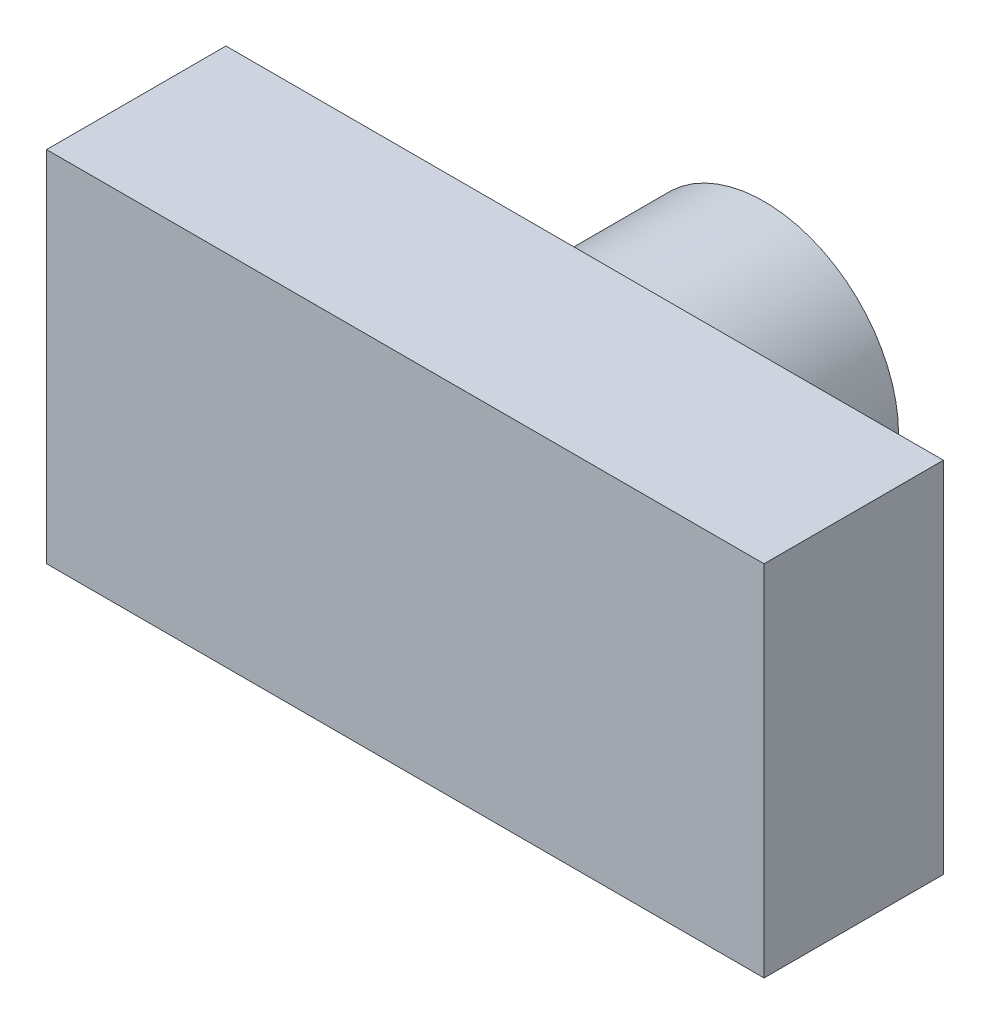
ISO-10303-21;
HEADER;
FILE_DESCRIPTION(('STEP AP214'),'2;1');
FILE_NAME('part.step','',(''),(''),'','','');
FILE_SCHEMA(('AUTOMOTIVE_DESIGN { 1 0 10303 214 1 1 1 1 }'));
ENDSEC;
DATA;
#1=APPLICATION_CONTEXT('core data for automotive mechanical design processes');
#2=APPLICATION_PROTOCOL_DEFINITION('international standard','automotive_design',2000,#1);
#3=PRODUCT_CONTEXT('',#1,'mechanical');
#4=PRODUCT('Part','Part','',(#3));
#5=PRODUCT_RELATED_PRODUCT_CATEGORY('part','',(#4));
#6=PRODUCT_DEFINITION_FORMATION('','',#4);
#7=PRODUCT_DEFINITION_CONTEXT('part definition',#1,'design');
#8=PRODUCT_DEFINITION('design','',#6,#7);
#9=PRODUCT_DEFINITION_SHAPE('','',#8);
#10=(LENGTH_UNIT() NAMED_UNIT(*) SI_UNIT(.MILLI.,.METRE.));
#11=(NAMED_UNIT(*) PLANE_ANGLE_UNIT() SI_UNIT($,.RADIAN.));
#12=(NAMED_UNIT(*) SI_UNIT($,.STERADIAN.) SOLID_ANGLE_UNIT());
#13=UNCERTAINTY_MEASURE_WITH_UNIT(LENGTH_MEASURE(1.E-05),#10,'distance_accuracy_value','');
#14=(GEOMETRIC_REPRESENTATION_CONTEXT(3) GLOBAL_UNCERTAINTY_ASSIGNED_CONTEXT((#13)) GLOBAL_UNIT_ASSIGNED_CONTEXT((#10,
#11,#12)) REPRESENTATION_CONTEXT('',''));
#15=CARTESIAN_POINT('',(0.,0.,0.));
#16=DIRECTION('',(0.,0.,1.));
#17=DIRECTION('',(1.,0.,0.));
#18=AXIS2_PLACEMENT_3D('',#15,#16,#17);
#19=CARTESIAN_POINT('',(50.8,-25.4,25.4));
#20=DIRECTION('',(-1.,0.,0.));
#21=DIRECTION('',(0.,0.,1.));
#22=AXIS2_PLACEMENT_3D('',#19,#20,#21);
#23=PLANE('',#22);
#24=DIRECTION('',(0.,1.,0.));
#25=VECTOR('',#24,1.);
#26=CARTESIAN_POINT('',(50.8,-25.4,0.));
#27=LINE('',#26,#25);
#28=CARTESIAN_POINT('',(50.8,-25.4,0.));
#29=VERTEX_POINT('',#28);
#30=CARTESIAN_POINT('',(50.8,25.4,0.));
#31=VERTEX_POINT('',#30);
#32=EDGE_CURVE('E105',#29,#31,#27,.T.);
#33=ORIENTED_EDGE('',*,*,#32,.T.);
#34=DIRECTION('',(0.,0.,-1.));
#35=VECTOR('',#34,1.);
#36=CARTESIAN_POINT('',(50.8,25.4,25.4));
#37=LINE('',#36,#35);
#38=CARTESIAN_POINT('',(50.8,25.4,25.4));
#39=VERTEX_POINT('',#38);
#40=EDGE_CURVE('E42',#39,#31,#37,.T.);
#41=ORIENTED_EDGE('',*,*,#40,.F.);
#42=DIRECTION('',(0.,1.,0.));
#43=VECTOR('',#42,1.);
#44=CARTESIAN_POINT('',(50.8,-25.4,25.4));
#45=LINE('',#44,#43);
#46=CARTESIAN_POINT('',(50.8,-25.4,25.4));
#47=VERTEX_POINT('',#46);
#48=EDGE_CURVE('E92',#47,#39,#45,.T.);
#49=ORIENTED_EDGE('',*,*,#48,.F.);
#50=DIRECTION('',(0.,0.,-1.));
#51=VECTOR('',#50,1.);
#52=CARTESIAN_POINT('',(50.8,-25.4,25.4));
#53=LINE('',#52,#51);
#54=EDGE_CURVE('E101',#47,#29,#53,.T.);
#55=ORIENTED_EDGE('',*,*,#54,.T.);
#56=EDGE_LOOP('',(#33,#41,#49,#55));
#57=FACE_BOUND('',#56,.T.);
#58=ADVANCED_FACE('F39',(#57),#23,.F.);
#59=CARTESIAN_POINT('',(-50.8,25.4,25.4));
#60=DIRECTION('',(0.,-1.,0.));
#61=DIRECTION('',(0.,0.,-1.));
#62=AXIS2_PLACEMENT_3D('',#59,#60,#61);
#63=PLANE('',#62);
#64=DIRECTION('',(-1.,0.,0.));
#65=VECTOR('',#64,1.);
#66=CARTESIAN_POINT('',(-50.8,25.4,0.));
#67=LINE('',#66,#65);
#68=CARTESIAN_POINT('',(-50.8,25.4,0.));
#69=VERTEX_POINT('',#68);
#70=EDGE_CURVE('E97',#31,#69,#67,.T.);
#71=ORIENTED_EDGE('',*,*,#70,.T.);
#72=DIRECTION('',(0.,0.,-1.));
#73=VECTOR('',#72,1.);
#74=CARTESIAN_POINT('',(-50.8,25.4,25.4));
#75=LINE('',#74,#73);
#76=CARTESIAN_POINT('',(-50.8,25.4,25.4));
#77=VERTEX_POINT('',#76);
#78=EDGE_CURVE('E95',#77,#69,#75,.T.);
#79=ORIENTED_EDGE('',*,*,#78,.F.);
#80=DIRECTION('',(-1.,0.,0.));
#81=VECTOR('',#80,1.);
#82=CARTESIAN_POINT('',(-50.8,25.4,25.4));
#83=LINE('',#82,#81);
#84=EDGE_CURVE('E87',#39,#77,#83,.T.);
#85=ORIENTED_EDGE('',*,*,#84,.F.);
#86=ORIENTED_EDGE('',*,*,#40,.T.);
#87=EDGE_LOOP('',(#71,#79,#85,#86));
#88=FACE_BOUND('',#87,.T.);
#89=ADVANCED_FACE('F96',(#88),#63,.F.);
#90=CARTESIAN_POINT('',(-50.8,-25.4,25.4));
#91=DIRECTION('',(1.,0.,0.));
#92=DIRECTION('',(0.,0.,-1.));
#93=AXIS2_PLACEMENT_3D('',#90,#91,#92);
#94=PLANE('',#93);
#95=DIRECTION('',(0.,-1.,0.));
#96=VECTOR('',#95,1.);
#97=CARTESIAN_POINT('',(-50.8,-25.4,0.));
#98=LINE('',#97,#96);
#99=CARTESIAN_POINT('',(-50.8,-25.4,0.));
#100=VERTEX_POINT('',#99);
#101=EDGE_CURVE('E73',#69,#100,#98,.T.);
#102=ORIENTED_EDGE('',*,*,#101,.T.);
#103=DIRECTION('',(0.,0.,-1.));
#104=VECTOR('',#103,1.);
#105=CARTESIAN_POINT('',(-50.8,-25.4,25.4));
#106=LINE('',#105,#104);
#107=CARTESIAN_POINT('',(-50.8,-25.4,25.4));
#108=VERTEX_POINT('',#107);
#109=EDGE_CURVE('E98',#108,#100,#106,.T.);
#110=ORIENTED_EDGE('',*,*,#109,.F.);
#111=DIRECTION('',(0.,-1.,0.));
#112=VECTOR('',#111,1.);
#113=CARTESIAN_POINT('',(-50.8,-25.4,25.4));
#114=LINE('',#113,#112);
#115=EDGE_CURVE('E90',#77,#108,#114,.T.);
#116=ORIENTED_EDGE('',*,*,#115,.F.);
#117=ORIENTED_EDGE('',*,*,#78,.T.);
#118=EDGE_LOOP('',(#102,#110,#116,#117));
#119=FACE_BOUND('',#118,.T.);
#120=ADVANCED_FACE('F99',(#119),#94,.F.);
#121=CARTESIAN_POINT('',(-50.8,-25.4,25.4));
#122=DIRECTION('',(0.,1.,0.));
#123=DIRECTION('',(0.,0.,1.));
#124=AXIS2_PLACEMENT_3D('',#121,#122,#123);
#125=PLANE('',#124);
#126=DIRECTION('',(1.,0.,0.));
#127=VECTOR('',#126,1.);
#128=CARTESIAN_POINT('',(-50.8,-25.4,0.));
#129=LINE('',#128,#127);
#130=EDGE_CURVE('E79',#100,#29,#129,.T.);
#131=ORIENTED_EDGE('',*,*,#130,.T.);
#132=ORIENTED_EDGE('',*,*,#54,.F.);
#133=DIRECTION('',(1.,0.,0.));
#134=VECTOR('',#133,1.);
#135=CARTESIAN_POINT('',(-50.8,-25.4,25.4));
#136=LINE('',#135,#134);
#137=EDGE_CURVE('E56',#108,#47,#136,.T.);
#138=ORIENTED_EDGE('',*,*,#137,.F.);
#139=ORIENTED_EDGE('',*,*,#109,.T.);
#140=EDGE_LOOP('',(#131,#132,#138,#139));
#141=FACE_BOUND('',#140,.T.);
#142=ADVANCED_FACE('F113',(#141),#125,.F.);
#143=CARTESIAN_POINT('',(0.,0.,25.4));
#144=DIRECTION('',(0.,0.,-1.));
#145=DIRECTION('',(-1.,0.,0.));
#146=AXIS2_PLACEMENT_3D('',#143,#144,#145);
#147=PLANE('',#146);
#148=ORIENTED_EDGE('',*,*,#48,.T.);
#149=ORIENTED_EDGE('',*,*,#84,.T.);
#150=ORIENTED_EDGE('',*,*,#115,.T.);
#151=ORIENTED_EDGE('',*,*,#137,.T.);
#152=EDGE_LOOP('',(#148,#149,#150,#151));
#153=FACE_BOUND('',#152,.T.);
#154=ADVANCED_FACE('F88',(#153),#147,.F.);
#155=CARTESIAN_POINT('',(0.,0.,0.));
#156=DIRECTION('',(0.,0.,-1.));
#157=DIRECTION('',(-1.,0.,0.));
#158=AXIS2_PLACEMENT_3D('',#155,#156,#157);
#159=PLANE('',#158);
#160=CARTESIAN_POINT('',(0.,0.,0.));
#161=DIRECTION('',(0.,0.,-1.));
#162=DIRECTION('',(-1.,0.,0.));
#163=AXIS2_PLACEMENT_3D('',#160,#161,#162);
#164=CIRCLE('',#163,19.05);
#165=CARTESIAN_POINT('',(-19.05,0.,0.));
#166=VERTEX_POINT('',#165);
#167=EDGE_CURVE('E11',#166,#166,#164,.T.);
#168=ORIENTED_EDGE('',*,*,#167,.F.);
#169=EDGE_LOOP('',(#168));
#170=FACE_BOUND('',#169,.T.);
#171=ORIENTED_EDGE('',*,*,#32,.F.);
#172=ORIENTED_EDGE('',*,*,#130,.F.);
#173=ORIENTED_EDGE('',*,*,#101,.F.);
#174=ORIENTED_EDGE('',*,*,#70,.F.);
#175=EDGE_LOOP('',(#171,#172,#173,#174));
#176=FACE_BOUND('',#175,.T.);
#177=ADVANCED_FACE('F116',(#170,#176),#159,.T.);
#178=CARTESIAN_POINT('',(0.,0.,-25.4));
#179=DIRECTION('',(0.,0.,1.));
#180=DIRECTION('',(1.,0.,0.));
#181=AXIS2_PLACEMENT_3D('',#178,#179,#180);
#182=CYLINDRICAL_SURFACE('',#181,19.05);
#183=CARTESIAN_POINT('',(0.,0.,-25.4));
#184=DIRECTION('',(0.,0.,-1.));
#185=DIRECTION('',(-1.,0.,0.));
#186=AXIS2_PLACEMENT_3D('',#183,#184,#185);
#187=CIRCLE('',#186,19.05);
#188=CARTESIAN_POINT('',(-19.05,0.,-25.4));
#189=VERTEX_POINT('',#188);
#190=EDGE_CURVE('E108',#189,#189,#187,.T.);
#191=ORIENTED_EDGE('',*,*,#190,.F.);
#192=EDGE_LOOP('',(#191));
#193=FACE_BOUND('',#192,.T.);
#194=ORIENTED_EDGE('',*,*,#167,.T.);
#195=EDGE_LOOP('',(#194));
#196=FACE_BOUND('',#195,.T.);
#197=ADVANCED_FACE('F124',(#193,#196),#182,.T.);
#198=CARTESIAN_POINT('',(0.,0.,-25.4));
#199=DIRECTION('',(0.,0.,-1.));
#200=DIRECTION('',(-1.,0.,0.));
#201=AXIS2_PLACEMENT_3D('',#198,#199,#200);
#202=PLANE('',#201);
#203=ORIENTED_EDGE('',*,*,#190,.T.);
#204=EDGE_LOOP('',(#203));
#205=FACE_BOUND('',#204,.T.);
#206=ADVANCED_FACE('F122',(#205),#202,.T.);
#207=CLOSED_SHELL('',(#58,#89,#120,#142,#154,#177,#197,#206));
#208=MANIFOLD_SOLID_BREP('B2',#207);
#209=ADVANCED_BREP_SHAPE_REPRESENTATION('',(#18,#208),#14);
#210=SHAPE_DEFINITION_REPRESENTATION(#9,#209);
ENDSEC;
END-ISO-10303-21;
